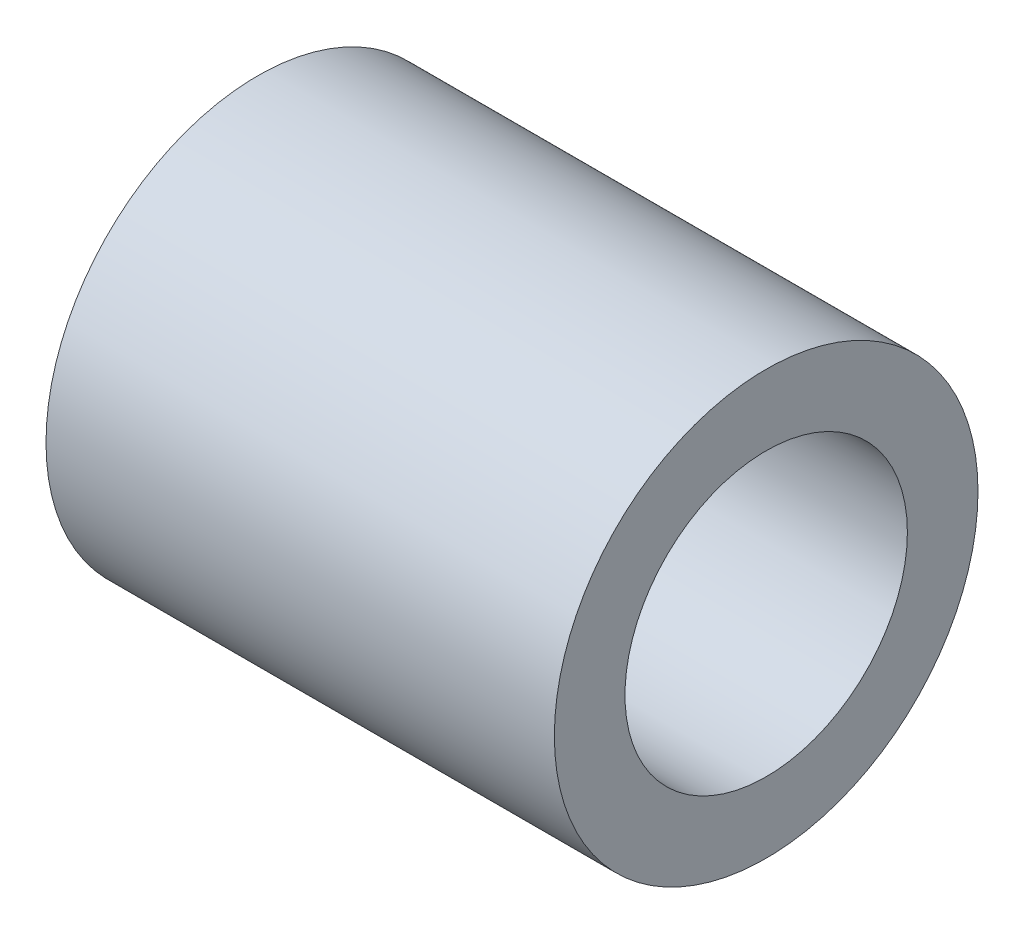
ISO-10303-21;
HEADER;
FILE_DESCRIPTION(('STEP AP214'),'2;1');
FILE_NAME('part.step','',(''),(''),'','','');
FILE_SCHEMA(('AUTOMOTIVE_DESIGN { 1 0 10303 214 1 1 1 1 }'));
ENDSEC;
DATA;
#1=APPLICATION_CONTEXT('core data for automotive mechanical design processes');
#2=APPLICATION_PROTOCOL_DEFINITION('international standard','automotive_design',2000,#1);
#3=PRODUCT_CONTEXT('',#1,'mechanical');
#4=PRODUCT('Part','Part','',(#3));
#5=PRODUCT_RELATED_PRODUCT_CATEGORY('part','',(#4));
#6=PRODUCT_DEFINITION_FORMATION('','',#4);
#7=PRODUCT_DEFINITION_CONTEXT('part definition',#1,'design');
#8=PRODUCT_DEFINITION('design','',#6,#7);
#9=PRODUCT_DEFINITION_SHAPE('','',#8);
#10=(LENGTH_UNIT() NAMED_UNIT(*) SI_UNIT(.MILLI.,.METRE.));
#11=(NAMED_UNIT(*) PLANE_ANGLE_UNIT() SI_UNIT($,.RADIAN.));
#12=(NAMED_UNIT(*) SI_UNIT($,.STERADIAN.) SOLID_ANGLE_UNIT());
#13=UNCERTAINTY_MEASURE_WITH_UNIT(LENGTH_MEASURE(1.E-05),#10,'distance_accuracy_value','');
#14=(GEOMETRIC_REPRESENTATION_CONTEXT(3) GLOBAL_UNCERTAINTY_ASSIGNED_CONTEXT((#13)) GLOBAL_UNIT_ASSIGNED_CONTEXT((#10,
#11,#12)) REPRESENTATION_CONTEXT('',''));
#15=CARTESIAN_POINT('',(0.,0.,0.));
#16=DIRECTION('',(0.,0.,1.));
#17=DIRECTION('',(1.,0.,0.));
#18=AXIS2_PLACEMENT_3D('',#15,#16,#17);
#19=CARTESIAN_POINT('',(18.,0.,0.));
#20=DIRECTION('',(1.,0.,0.));
#21=DIRECTION('',(0.,0.,-1.));
#22=AXIS2_PLACEMENT_3D('',#19,#20,#21);
#23=PLANE('',#22);
#24=CARTESIAN_POINT('',(18.,0.,0.));
#25=DIRECTION('',(1.,0.,0.));
#26=DIRECTION('',(0.,0.,-1.));
#27=AXIS2_PLACEMENT_3D('',#24,#25,#26);
#28=CIRCLE('',#27,7.5);
#29=CARTESIAN_POINT('',(18.,0.,-7.5));
#30=VERTEX_POINT('',#29);
#31=EDGE_CURVE('E10',#30,#30,#28,.T.);
#32=ORIENTED_EDGE('',*,*,#31,.T.);
#33=EDGE_LOOP('',(#32));
#34=FACE_BOUND('',#33,.T.);
#35=CARTESIAN_POINT('',(18.,0.,0.));
#36=DIRECTION('',(1.,0.,0.));
#37=DIRECTION('',(0.,0.,-1.));
#38=AXIS2_PLACEMENT_3D('',#35,#36,#37);
#39=CIRCLE('',#38,5.);
#40=CARTESIAN_POINT('',(18.,0.,-5.));
#41=VERTEX_POINT('',#40);
#42=EDGE_CURVE('E54',#41,#41,#39,.T.);
#43=ORIENTED_EDGE('',*,*,#42,.F.);
#44=EDGE_LOOP('',(#43));
#45=FACE_BOUND('',#44,.T.);
#46=ADVANCED_FACE('F41',(#34,#45),#23,.T.);
#47=CARTESIAN_POINT('',(0.,0.,0.));
#48=DIRECTION('',(1.,0.,0.));
#49=DIRECTION('',(0.,0.,-1.));
#50=AXIS2_PLACEMENT_3D('',#47,#48,#49);
#51=PLANE('',#50);
#52=CARTESIAN_POINT('',(0.,0.,0.));
#53=DIRECTION('',(1.,0.,0.));
#54=DIRECTION('',(0.,0.,-1.));
#55=AXIS2_PLACEMENT_3D('',#52,#53,#54);
#56=CIRCLE('',#55,7.5);
#57=CARTESIAN_POINT('',(0.,0.,-7.5));
#58=VERTEX_POINT('',#57);
#59=EDGE_CURVE('E45',#58,#58,#56,.T.);
#60=ORIENTED_EDGE('',*,*,#59,.F.);
#61=EDGE_LOOP('',(#60));
#62=FACE_BOUND('',#61,.T.);
#63=CARTESIAN_POINT('',(0.,0.,0.));
#64=DIRECTION('',(1.,0.,0.));
#65=DIRECTION('',(0.,0.,-1.));
#66=AXIS2_PLACEMENT_3D('',#63,#64,#65);
#67=CIRCLE('',#66,5.);
#68=CARTESIAN_POINT('',(0.,0.,-5.));
#69=VERTEX_POINT('',#68);
#70=EDGE_CURVE('E56',#69,#69,#67,.T.);
#71=ORIENTED_EDGE('',*,*,#70,.T.);
#72=EDGE_LOOP('',(#71));
#73=FACE_BOUND('',#72,.T.);
#74=ADVANCED_FACE('F68',(#62,#73),#51,.F.);
#75=CARTESIAN_POINT('',(18.,0.,0.));
#76=DIRECTION('',(-1.,0.,0.));
#77=DIRECTION('',(0.,0.,1.));
#78=AXIS2_PLACEMENT_3D('',#75,#76,#77);
#79=CYLINDRICAL_SURFACE('',#78,7.5);
#80=ORIENTED_EDGE('',*,*,#31,.F.);
#81=EDGE_LOOP('',(#80));
#82=FACE_BOUND('',#81,.T.);
#83=ORIENTED_EDGE('',*,*,#59,.T.);
#84=EDGE_LOOP('',(#83));
#85=FACE_BOUND('',#84,.T.);
#86=ADVANCED_FACE('F43',(#82,#85),#79,.T.);
#87=CARTESIAN_POINT('',(18.,0.,0.));
#88=DIRECTION('',(-1.,0.,0.));
#89=DIRECTION('',(0.,0.,1.));
#90=AXIS2_PLACEMENT_3D('',#87,#88,#89);
#91=CYLINDRICAL_SURFACE('',#90,5.);
#92=ORIENTED_EDGE('',*,*,#42,.T.);
#93=EDGE_LOOP('',(#92));
#94=FACE_BOUND('',#93,.T.);
#95=ORIENTED_EDGE('',*,*,#70,.F.);
#96=EDGE_LOOP('',(#95));
#97=FACE_BOUND('',#96,.T.);
#98=ADVANCED_FACE('F64',(#94,#97),#91,.F.);
#99=CLOSED_SHELL('',(#46,#74,#86,#98));
#100=MANIFOLD_SOLID_BREP('B2',#99);
#101=ADVANCED_BREP_SHAPE_REPRESENTATION('',(#18,#100),#14);
#102=SHAPE_DEFINITION_REPRESENTATION(#9,#101);
ENDSEC;
END-ISO-10303-21;
